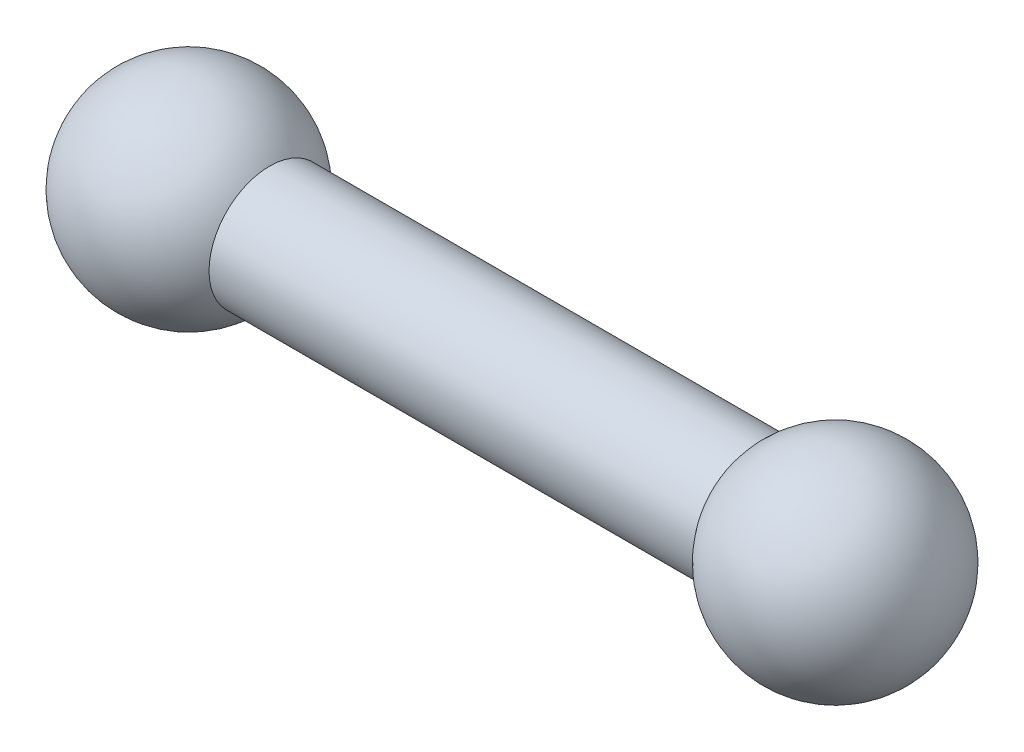
ISO-10303-21;
HEADER;
FILE_DESCRIPTION(('STEP AP214'),'2;1');
FILE_NAME('part.step','',(''),(''),'','','');
FILE_SCHEMA(('AUTOMOTIVE_DESIGN { 1 0 10303 214 1 1 1 1 }'));
ENDSEC;
DATA;
#1=APPLICATION_CONTEXT('core data for automotive mechanical design processes');
#2=APPLICATION_PROTOCOL_DEFINITION('international standard','automotive_design',2000,#1);
#3=PRODUCT_CONTEXT('',#1,'mechanical');
#4=PRODUCT('Part','Part','',(#3));
#5=PRODUCT_RELATED_PRODUCT_CATEGORY('part','',(#4));
#6=PRODUCT_DEFINITION_FORMATION('','',#4);
#7=PRODUCT_DEFINITION_CONTEXT('part definition',#1,'design');
#8=PRODUCT_DEFINITION('design','',#6,#7);
#9=PRODUCT_DEFINITION_SHAPE('','',#8);
#10=(LENGTH_UNIT() NAMED_UNIT(*) SI_UNIT(.MILLI.,.METRE.));
#11=(NAMED_UNIT(*) PLANE_ANGLE_UNIT() SI_UNIT($,.RADIAN.));
#12=(NAMED_UNIT(*) SI_UNIT($,.STERADIAN.) SOLID_ANGLE_UNIT());
#13=UNCERTAINTY_MEASURE_WITH_UNIT(LENGTH_MEASURE(1.E-05),#10,'distance_accuracy_value','');
#14=(GEOMETRIC_REPRESENTATION_CONTEXT(3) GLOBAL_UNCERTAINTY_ASSIGNED_CONTEXT((#13)) GLOBAL_UNIT_ASSIGNED_CONTEXT((#10,
#11,#12)) REPRESENTATION_CONTEXT('',''));
#15=CARTESIAN_POINT('',(0.,0.,0.));
#16=DIRECTION('',(0.,0.,1.));
#17=DIRECTION('',(1.,0.,0.));
#18=AXIS2_PLACEMENT_3D('',#15,#16,#17);
#19=CARTESIAN_POINT('',(0.,0.,0.));
#20=DIRECTION('',(-1.,0.,0.));
#21=DIRECTION('',(0.,1.,0.));
#22=AXIS2_PLACEMENT_3D('',#19,#20,#21);
#23=SPHERICAL_SURFACE('',#22,2.5);
#24=CARTESIAN_POINT('',(2.,0.,0.));
#25=DIRECTION('',(-1.,0.,0.));
#26=DIRECTION('',(0.,0.,1.));
#27=AXIS2_PLACEMENT_3D('',#24,#25,#26);
#28=CIRCLE('',#27,1.5);
#29=CARTESIAN_POINT('',(2.,0.,1.5));
#30=VERTEX_POINT('',#29);
#31=EDGE_CURVE('E10',#30,#30,#28,.T.);
#32=ORIENTED_EDGE('',*,*,#31,.T.);
#33=EDGE_LOOP('',(#32));
#34=FACE_BOUND('',#33,.T.);
#35=ADVANCED_FACE('F31',(#34),#23,.T.);
#36=CARTESIAN_POINT('',(-2.5,0.,0.));
#37=DIRECTION('',(-1.,0.,0.));
#38=DIRECTION('',(0.,0.,1.));
#39=AXIS2_PLACEMENT_3D('',#36,#37,#38);
#40=CYLINDRICAL_SURFACE('',#39,1.5);
#41=ORIENTED_EDGE('',*,*,#31,.F.);
#42=EDGE_LOOP('',(#41));
#43=FACE_BOUND('',#42,.T.);
#44=CARTESIAN_POINT('',(14.,0.,0.));
#45=DIRECTION('',(-1.,0.,0.));
#46=DIRECTION('',(0.,0.,1.));
#47=AXIS2_PLACEMENT_3D('',#44,#45,#46);
#48=CIRCLE('',#47,1.5);
#49=CARTESIAN_POINT('',(14.,0.,1.5));
#50=VERTEX_POINT('',#49);
#51=EDGE_CURVE('E37',#50,#50,#48,.T.);
#52=ORIENTED_EDGE('',*,*,#51,.T.);
#53=EDGE_LOOP('',(#52));
#54=FACE_BOUND('',#53,.T.);
#55=ADVANCED_FACE('F43',(#43,#54),#40,.T.);
#56=CARTESIAN_POINT('',(16.,0.,0.));
#57=DIRECTION('',(-1.,0.,0.));
#58=DIRECTION('',(0.,1.,0.));
#59=AXIS2_PLACEMENT_3D('',#56,#57,#58);
#60=SPHERICAL_SURFACE('',#59,2.50000000000001);
#61=ORIENTED_EDGE('',*,*,#51,.F.);
#62=EDGE_LOOP('',(#61));
#63=FACE_BOUND('',#62,.T.);
#64=ADVANCED_FACE('F45',(#63),#60,.T.);
#65=CLOSED_SHELL('',(#35,#55,#64));
#66=MANIFOLD_SOLID_BREP('B2',#65);
#67=ADVANCED_BREP_SHAPE_REPRESENTATION('',(#18,#66),#14);
#68=SHAPE_DEFINITION_REPRESENTATION(#9,#67);
ENDSEC;
END-ISO-10303-21;
